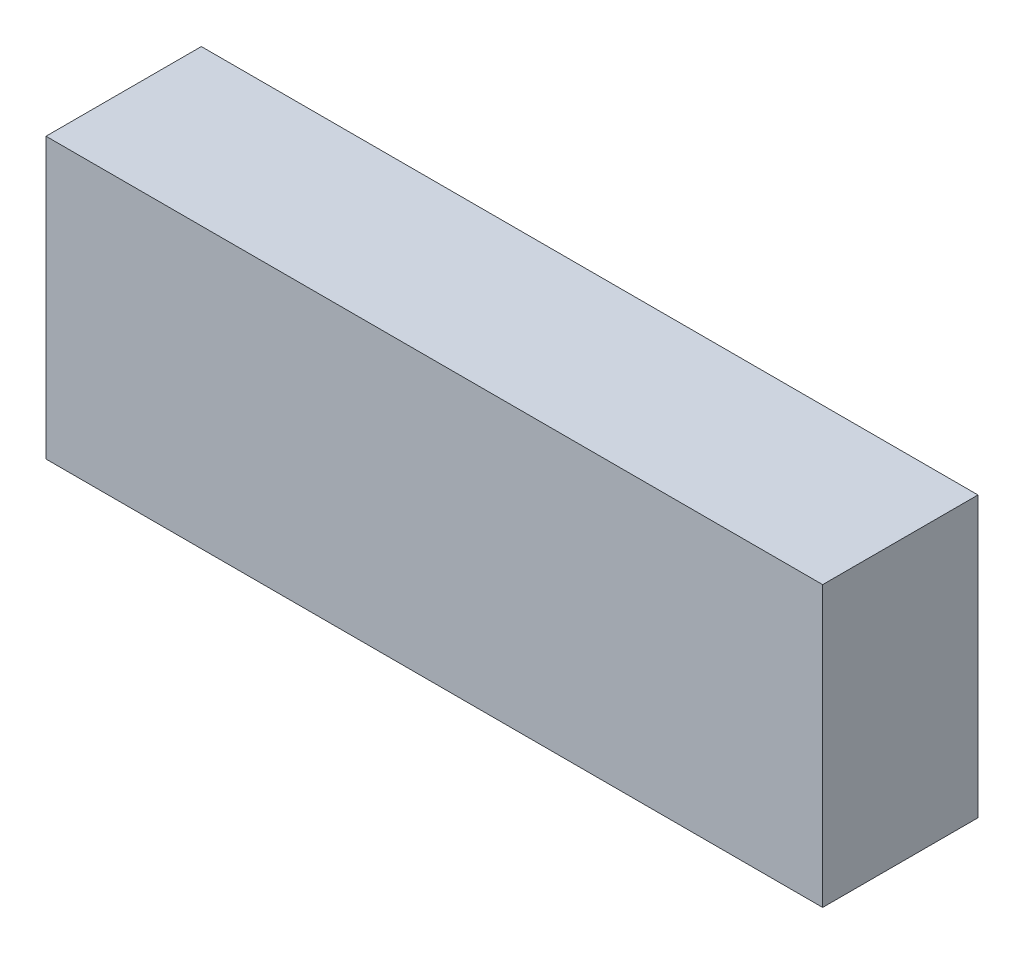
ISO-10303-21;
HEADER;
FILE_DESCRIPTION(('STEP AP214'),'2;1');
FILE_NAME('part.step','',(''),(''),'','','');
FILE_SCHEMA(('AUTOMOTIVE_DESIGN { 1 0 10303 214 1 1 1 1 }'));
ENDSEC;
DATA;
#1=APPLICATION_CONTEXT('core data for automotive mechanical design processes');
#2=APPLICATION_PROTOCOL_DEFINITION('international standard','automotive_design',2000,#1);
#3=PRODUCT_CONTEXT('',#1,'mechanical');
#4=PRODUCT('Part','Part','',(#3));
#5=PRODUCT_RELATED_PRODUCT_CATEGORY('part','',(#4));
#6=PRODUCT_DEFINITION_FORMATION('','',#4);
#7=PRODUCT_DEFINITION_CONTEXT('part definition',#1,'design');
#8=PRODUCT_DEFINITION('design','',#6,#7);
#9=PRODUCT_DEFINITION_SHAPE('','',#8);
#10=(LENGTH_UNIT() NAMED_UNIT(*) SI_UNIT(.MILLI.,.METRE.));
#11=(NAMED_UNIT(*) PLANE_ANGLE_UNIT() SI_UNIT($,.RADIAN.));
#12=(NAMED_UNIT(*) SI_UNIT($,.STERADIAN.) SOLID_ANGLE_UNIT());
#13=UNCERTAINTY_MEASURE_WITH_UNIT(LENGTH_MEASURE(1.E-05),#10,'distance_accuracy_value','');
#14=(GEOMETRIC_REPRESENTATION_CONTEXT(3) GLOBAL_UNCERTAINTY_ASSIGNED_CONTEXT((#13)) GLOBAL_UNIT_ASSIGNED_CONTEXT((#10,
#11,#12)) REPRESENTATION_CONTEXT('',''));
#15=CARTESIAN_POINT('',(0.,0.,0.));
#16=DIRECTION('',(0.,0.,1.));
#17=DIRECTION('',(1.,0.,0.));
#18=AXIS2_PLACEMENT_3D('',#15,#16,#17);
#19=CARTESIAN_POINT('',(0.,0.,10.));
#20=DIRECTION('',(1.,0.,0.));
#21=DIRECTION('',(0.,1.,0.));
#22=AXIS2_PLACEMENT_3D('',#19,#20,#21);
#23=PLANE('',#22);
#24=DIRECTION('',(0.,-1.,0.));
#25=VECTOR('',#24,1.);
#26=CARTESIAN_POINT('',(0.,0.,0.));
#27=LINE('',#26,#25);
#28=CARTESIAN_POINT('',(0.,18.,0.));
#29=VERTEX_POINT('',#28);
#30=CARTESIAN_POINT('',(0.,0.,0.));
#31=VERTEX_POINT('',#30);
#32=EDGE_CURVE('E107',#29,#31,#27,.T.);
#33=ORIENTED_EDGE('',*,*,#32,.T.);
#34=DIRECTION('',(0.,0.,-1.));
#35=VECTOR('',#34,1.);
#36=CARTESIAN_POINT('',(0.,0.,10.));
#37=LINE('',#36,#35);
#38=CARTESIAN_POINT('',(0.,0.,10.));
#39=VERTEX_POINT('',#38);
#40=EDGE_CURVE('E11',#39,#31,#37,.T.);
#41=ORIENTED_EDGE('',*,*,#40,.F.);
#42=DIRECTION('',(0.,-1.,0.));
#43=VECTOR('',#42,1.);
#44=CARTESIAN_POINT('',(0.,0.,10.));
#45=LINE('',#44,#43);
#46=CARTESIAN_POINT('',(0.,18.,10.));
#47=VERTEX_POINT('',#46);
#48=EDGE_CURVE('E91',#47,#39,#45,.T.);
#49=ORIENTED_EDGE('',*,*,#48,.F.);
#50=DIRECTION('',(0.,0.,-1.));
#51=VECTOR('',#50,1.);
#52=CARTESIAN_POINT('',(0.,18.,10.));
#53=LINE('',#52,#51);
#54=EDGE_CURVE('E103',#47,#29,#53,.T.);
#55=ORIENTED_EDGE('',*,*,#54,.T.);
#56=EDGE_LOOP('',(#33,#41,#49,#55));
#57=FACE_BOUND('',#56,.T.);
#58=ADVANCED_FACE('F39',(#57),#23,.F.);
#59=CARTESIAN_POINT('',(0.,0.,10.));
#60=DIRECTION('',(0.,1.,0.));
#61=DIRECTION('',(0.,0.,1.));
#62=AXIS2_PLACEMENT_3D('',#59,#60,#61);
#63=PLANE('',#62);
#64=DIRECTION('',(1.,0.,0.));
#65=VECTOR('',#64,1.);
#66=CARTESIAN_POINT('',(0.,0.,0.));
#67=LINE('',#66,#65);
#68=CARTESIAN_POINT('',(50.,0.,0.));
#69=VERTEX_POINT('',#68);
#70=EDGE_CURVE('E96',#31,#69,#67,.T.);
#71=ORIENTED_EDGE('',*,*,#70,.T.);
#72=DIRECTION('',(0.,0.,-1.));
#73=VECTOR('',#72,1.);
#74=CARTESIAN_POINT('',(50.,0.,10.));
#75=LINE('',#74,#73);
#76=CARTESIAN_POINT('',(50.,0.,10.));
#77=VERTEX_POINT('',#76);
#78=EDGE_CURVE('E48',#77,#69,#75,.T.);
#79=ORIENTED_EDGE('',*,*,#78,.F.);
#80=DIRECTION('',(1.,0.,0.));
#81=VECTOR('',#80,1.);
#82=CARTESIAN_POINT('',(0.,0.,10.));
#83=LINE('',#82,#81);
#84=EDGE_CURVE('E86',#39,#77,#83,.T.);
#85=ORIENTED_EDGE('',*,*,#84,.F.);
#86=ORIENTED_EDGE('',*,*,#40,.T.);
#87=EDGE_LOOP('',(#71,#79,#85,#86));
#88=FACE_BOUND('',#87,.T.);
#89=ADVANCED_FACE('F95',(#88),#63,.F.);
#90=CARTESIAN_POINT('',(50.,0.,10.));
#91=DIRECTION('',(-1.,0.,0.));
#92=DIRECTION('',(0.,0.,1.));
#93=AXIS2_PLACEMENT_3D('',#90,#91,#92);
#94=PLANE('',#93);
#95=DIRECTION('',(0.,1.,0.));
#96=VECTOR('',#95,1.);
#97=CARTESIAN_POINT('',(50.,0.,0.));
#98=LINE('',#97,#96);
#99=CARTESIAN_POINT('',(50.,18.,0.));
#100=VERTEX_POINT('',#99);
#101=EDGE_CURVE('E73',#69,#100,#98,.T.);
#102=ORIENTED_EDGE('',*,*,#101,.T.);
#103=DIRECTION('',(0.,0.,-1.));
#104=VECTOR('',#103,1.);
#105=CARTESIAN_POINT('',(50.,18.,10.));
#106=LINE('',#105,#104);
#107=CARTESIAN_POINT('',(50.,18.,10.));
#108=VERTEX_POINT('',#107);
#109=EDGE_CURVE('E98',#108,#100,#106,.T.);
#110=ORIENTED_EDGE('',*,*,#109,.F.);
#111=DIRECTION('',(0.,1.,0.));
#112=VECTOR('',#111,1.);
#113=CARTESIAN_POINT('',(50.,0.,10.));
#114=LINE('',#113,#112);
#115=EDGE_CURVE('E89',#77,#108,#114,.T.);
#116=ORIENTED_EDGE('',*,*,#115,.F.);
#117=ORIENTED_EDGE('',*,*,#78,.T.);
#118=EDGE_LOOP('',(#102,#110,#116,#117));
#119=FACE_BOUND('',#118,.T.);
#120=ADVANCED_FACE('F99',(#119),#94,.F.);
#121=CARTESIAN_POINT('',(0.,18.,10.));
#122=DIRECTION('',(0.,-1.,0.));
#123=DIRECTION('',(0.,0.,-1.));
#124=AXIS2_PLACEMENT_3D('',#121,#122,#123);
#125=PLANE('',#124);
#126=DIRECTION('',(-1.,0.,0.));
#127=VECTOR('',#126,1.);
#128=CARTESIAN_POINT('',(0.,18.,0.));
#129=LINE('',#128,#127);
#130=EDGE_CURVE('E79',#100,#29,#129,.T.);
#131=ORIENTED_EDGE('',*,*,#130,.T.);
#132=ORIENTED_EDGE('',*,*,#54,.F.);
#133=DIRECTION('',(-1.,0.,0.));
#134=VECTOR('',#133,1.);
#135=CARTESIAN_POINT('',(0.,18.,10.));
#136=LINE('',#135,#134);
#137=EDGE_CURVE('E56',#108,#47,#136,.T.);
#138=ORIENTED_EDGE('',*,*,#137,.F.);
#139=ORIENTED_EDGE('',*,*,#109,.T.);
#140=EDGE_LOOP('',(#131,#132,#138,#139));
#141=FACE_BOUND('',#140,.T.);
#142=ADVANCED_FACE('F120',(#141),#125,.F.);
#143=CARTESIAN_POINT('',(0.,0.,10.));
#144=DIRECTION('',(0.,0.,-1.));
#145=DIRECTION('',(-1.,0.,0.));
#146=AXIS2_PLACEMENT_3D('',#143,#144,#145);
#147=PLANE('',#146);
#148=ORIENTED_EDGE('',*,*,#48,.T.);
#149=ORIENTED_EDGE('',*,*,#84,.T.);
#150=ORIENTED_EDGE('',*,*,#115,.T.);
#151=ORIENTED_EDGE('',*,*,#137,.T.);
#152=EDGE_LOOP('',(#148,#149,#150,#151));
#153=FACE_BOUND('',#152,.T.);
#154=ADVANCED_FACE('F87',(#153),#147,.F.);
#155=CARTESIAN_POINT('',(0.,0.,0.));
#156=DIRECTION('',(0.,0.,-1.));
#157=DIRECTION('',(-1.,0.,0.));
#158=AXIS2_PLACEMENT_3D('',#155,#156,#157);
#159=PLANE('',#158);
#160=ORIENTED_EDGE('',*,*,#32,.F.);
#161=ORIENTED_EDGE('',*,*,#130,.F.);
#162=ORIENTED_EDGE('',*,*,#101,.F.);
#163=ORIENTED_EDGE('',*,*,#70,.F.);
#164=EDGE_LOOP('',(#160,#161,#162,#163));
#165=FACE_BOUND('',#164,.T.);
#166=ADVANCED_FACE('F123',(#165),#159,.T.);
#167=CLOSED_SHELL('',(#58,#89,#120,#142,#154,#166));
#168=MANIFOLD_SOLID_BREP('B2',#167);
#169=ADVANCED_BREP_SHAPE_REPRESENTATION('',(#18,#168),#14);
#170=SHAPE_DEFINITION_REPRESENTATION(#9,#169);
ENDSEC;
END-ISO-10303-21;
